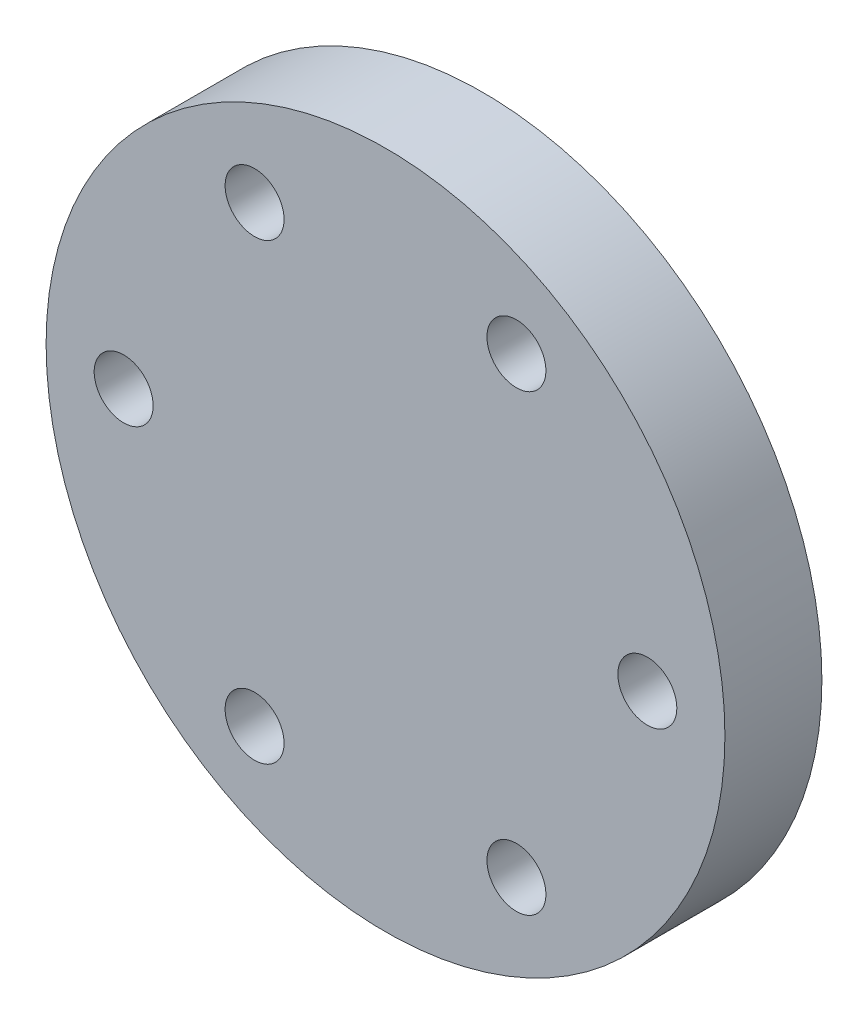
ISO-10303-21;
HEADER;
FILE_DESCRIPTION(('STEP AP214'),'2;1');
FILE_NAME('part.step','',(''),(''),'','','');
FILE_SCHEMA(('AUTOMOTIVE_DESIGN { 1 0 10303 214 1 1 1 1 }'));
ENDSEC;
DATA;
#1=APPLICATION_CONTEXT('core data for automotive mechanical design processes');
#2=APPLICATION_PROTOCOL_DEFINITION('international standard','automotive_design',2000,#1);
#3=PRODUCT_CONTEXT('',#1,'mechanical');
#4=PRODUCT('Part','Part','',(#3));
#5=PRODUCT_RELATED_PRODUCT_CATEGORY('part','',(#4));
#6=PRODUCT_DEFINITION_FORMATION('','',#4);
#7=PRODUCT_DEFINITION_CONTEXT('part definition',#1,'design');
#8=PRODUCT_DEFINITION('design','',#6,#7);
#9=PRODUCT_DEFINITION_SHAPE('','',#8);
#10=(LENGTH_UNIT() NAMED_UNIT(*) SI_UNIT(.MILLI.,.METRE.));
#11=(NAMED_UNIT(*) PLANE_ANGLE_UNIT() SI_UNIT($,.RADIAN.));
#12=(NAMED_UNIT(*) SI_UNIT($,.STERADIAN.) SOLID_ANGLE_UNIT());
#13=UNCERTAINTY_MEASURE_WITH_UNIT(LENGTH_MEASURE(1.E-05),#10,'distance_accuracy_value','');
#14=(GEOMETRIC_REPRESENTATION_CONTEXT(3) GLOBAL_UNCERTAINTY_ASSIGNED_CONTEXT((#13)) GLOBAL_UNIT_ASSIGNED_CONTEXT((#10,
#11,#12)) REPRESENTATION_CONTEXT('',''));
#15=CARTESIAN_POINT('',(0.,0.,0.));
#16=DIRECTION('',(0.,0.,1.));
#17=DIRECTION('',(1.,0.,0.));
#18=AXIS2_PLACEMENT_3D('',#15,#16,#17);
#19=CARTESIAN_POINT('',(0.,0.,0.));
#20=DIRECTION('',(0.,0.,1.));
#21=DIRECTION('',(1.,0.,0.));
#22=AXIS2_PLACEMENT_3D('',#19,#20,#21);
#23=PLANE('',#22);
#24=CARTESIAN_POINT('',(-6.75000000000001,-11.6913429510899,0.));
#25=DIRECTION('',(0.,0.,1.));
#26=DIRECTION('',(1.,0.,0.));
#27=AXIS2_PLACEMENT_3D('',#24,#25,#26);
#28=CIRCLE('',#27,1.52);
#29=CARTESIAN_POINT('',(-5.23000000000001,-11.6913429510899,0.));
#30=VERTEX_POINT('',#29);
#31=EDGE_CURVE('E75',#30,#30,#28,.T.);
#32=ORIENTED_EDGE('',*,*,#31,.F.);
#33=EDGE_LOOP('',(#32));
#34=FACE_BOUND('',#33,.T.);
#35=CARTESIAN_POINT('',(-6.75,11.6913429510899,0.));
#36=DIRECTION('',(0.,0.,1.));
#37=DIRECTION('',(1.,0.,0.));
#38=AXIS2_PLACEMENT_3D('',#35,#36,#37);
#39=CIRCLE('',#38,1.52);
#40=CARTESIAN_POINT('',(-5.23,11.6913429510899,0.));
#41=VERTEX_POINT('',#40);
#42=EDGE_CURVE('E63',#41,#41,#39,.T.);
#43=ORIENTED_EDGE('',*,*,#42,.F.);
#44=EDGE_LOOP('',(#43));
#45=FACE_BOUND('',#44,.T.);
#46=CARTESIAN_POINT('',(13.5,0.,0.));
#47=DIRECTION('',(0.,0.,1.));
#48=DIRECTION('',(1.,0.,0.));
#49=AXIS2_PLACEMENT_3D('',#46,#47,#48);
#50=CIRCLE('',#49,1.52);
#51=CARTESIAN_POINT('',(15.02,0.,0.));
#52=VERTEX_POINT('',#51);
#53=EDGE_CURVE('E52',#52,#52,#50,.T.);
#54=ORIENTED_EDGE('',*,*,#53,.F.);
#55=EDGE_LOOP('',(#54));
#56=FACE_BOUND('',#55,.T.);
#57=CARTESIAN_POINT('',(0.,0.,0.));
#58=DIRECTION('',(0.,0.,1.));
#59=DIRECTION('',(1.,0.,0.));
#60=AXIS2_PLACEMENT_3D('',#57,#58,#59);
#61=CIRCLE('',#60,17.5);
#62=CARTESIAN_POINT('',(17.5,0.,0.));
#63=VERTEX_POINT('',#62);
#64=EDGE_CURVE('E10',#63,#63,#61,.T.);
#65=ORIENTED_EDGE('',*,*,#64,.T.);
#66=EDGE_LOOP('',(#65));
#67=FACE_BOUND('',#66,.T.);
#68=CARTESIAN_POINT('',(6.75,11.6913429510899,0.));
#69=DIRECTION('',(0.,0.,1.));
#70=DIRECTION('',(1.,0.,0.));
#71=AXIS2_PLACEMENT_3D('',#68,#69,#70);
#72=CIRCLE('',#71,1.52);
#73=CARTESIAN_POINT('',(8.27,11.6913429510899,0.));
#74=VERTEX_POINT('',#73);
#75=EDGE_CURVE('E57',#74,#74,#72,.T.);
#76=ORIENTED_EDGE('',*,*,#75,.F.);
#77=EDGE_LOOP('',(#76));
#78=FACE_BOUND('',#77,.T.);
#79=CARTESIAN_POINT('',(-13.5,0.,0.));
#80=DIRECTION('',(0.,0.,1.));
#81=DIRECTION('',(1.,0.,0.));
#82=AXIS2_PLACEMENT_3D('',#79,#80,#81);
#83=CIRCLE('',#82,1.52);
#84=CARTESIAN_POINT('',(-11.98,0.,0.));
#85=VERTEX_POINT('',#84);
#86=EDGE_CURVE('E69',#85,#85,#83,.T.);
#87=ORIENTED_EDGE('',*,*,#86,.F.);
#88=EDGE_LOOP('',(#87));
#89=FACE_BOUND('',#88,.T.);
#90=CARTESIAN_POINT('',(6.75,-11.6913429510899,0.));
#91=DIRECTION('',(0.,0.,1.));
#92=DIRECTION('',(1.,0.,0.));
#93=AXIS2_PLACEMENT_3D('',#90,#91,#92);
#94=CIRCLE('',#93,1.52);
#95=CARTESIAN_POINT('',(8.27,-11.6913429510899,0.));
#96=VERTEX_POINT('',#95);
#97=EDGE_CURVE('E81',#96,#96,#94,.T.);
#98=ORIENTED_EDGE('',*,*,#97,.F.);
#99=EDGE_LOOP('',(#98));
#100=FACE_BOUND('',#99,.T.);
#101=ADVANCED_FACE('F41',(#34,#45,#56,#67,#78,#89,#100),#23,.T.);
#102=CARTESIAN_POINT('',(0.,0.,-5.));
#103=DIRECTION('',(0.,0.,1.));
#104=DIRECTION('',(1.,0.,0.));
#105=AXIS2_PLACEMENT_3D('',#102,#103,#104);
#106=PLANE('',#105);
#107=CARTESIAN_POINT('',(0.,0.,-5.));
#108=DIRECTION('',(0.,0.,1.));
#109=DIRECTION('',(1.,0.,0.));
#110=AXIS2_PLACEMENT_3D('',#107,#108,#109);
#111=CIRCLE('',#110,17.5);
#112=CARTESIAN_POINT('',(17.5,0.,-5.));
#113=VERTEX_POINT('',#112);
#114=EDGE_CURVE('E45',#113,#113,#111,.T.);
#115=ORIENTED_EDGE('',*,*,#114,.F.);
#116=EDGE_LOOP('',(#115));
#117=FACE_BOUND('',#116,.T.);
#118=CARTESIAN_POINT('',(13.5,0.,-5.));
#119=DIRECTION('',(0.,0.,1.));
#120=DIRECTION('',(1.,0.,0.));
#121=AXIS2_PLACEMENT_3D('',#118,#119,#120);
#122=CIRCLE('',#121,1.52);
#123=CARTESIAN_POINT('',(15.02,0.,-5.));
#124=VERTEX_POINT('',#123);
#125=EDGE_CURVE('E54',#124,#124,#122,.T.);
#126=ORIENTED_EDGE('',*,*,#125,.T.);
#127=EDGE_LOOP('',(#126));
#128=FACE_BOUND('',#127,.T.);
#129=CARTESIAN_POINT('',(6.75,11.6913429510899,-5.));
#130=DIRECTION('',(0.,0.,1.));
#131=DIRECTION('',(1.,0.,0.));
#132=AXIS2_PLACEMENT_3D('',#129,#130,#131);
#133=CIRCLE('',#132,1.52);
#134=CARTESIAN_POINT('',(8.27,11.6913429510899,-5.));
#135=VERTEX_POINT('',#134);
#136=EDGE_CURVE('E60',#135,#135,#133,.T.);
#137=ORIENTED_EDGE('',*,*,#136,.T.);
#138=EDGE_LOOP('',(#137));
#139=FACE_BOUND('',#138,.T.);
#140=CARTESIAN_POINT('',(-6.75,11.6913429510899,-5.));
#141=DIRECTION('',(0.,0.,1.));
#142=DIRECTION('',(1.,0.,0.));
#143=AXIS2_PLACEMENT_3D('',#140,#141,#142);
#144=CIRCLE('',#143,1.52);
#145=CARTESIAN_POINT('',(-5.23,11.6913429510899,-5.));
#146=VERTEX_POINT('',#145);
#147=EDGE_CURVE('E66',#146,#146,#144,.T.);
#148=ORIENTED_EDGE('',*,*,#147,.T.);
#149=EDGE_LOOP('',(#148));
#150=FACE_BOUND('',#149,.T.);
#151=CARTESIAN_POINT('',(-13.5,0.,-5.));
#152=DIRECTION('',(0.,0.,1.));
#153=DIRECTION('',(1.,0.,0.));
#154=AXIS2_PLACEMENT_3D('',#151,#152,#153);
#155=CIRCLE('',#154,1.52);
#156=CARTESIAN_POINT('',(-11.98,0.,-5.));
#157=VERTEX_POINT('',#156);
#158=EDGE_CURVE('E72',#157,#157,#155,.T.);
#159=ORIENTED_EDGE('',*,*,#158,.T.);
#160=EDGE_LOOP('',(#159));
#161=FACE_BOUND('',#160,.T.);
#162=CARTESIAN_POINT('',(-6.75000000000001,-11.6913429510899,-5.));
#163=DIRECTION('',(0.,0.,1.));
#164=DIRECTION('',(1.,0.,0.));
#165=AXIS2_PLACEMENT_3D('',#162,#163,#164);
#166=CIRCLE('',#165,1.52);
#167=CARTESIAN_POINT('',(-5.23000000000001,-11.6913429510899,-5.));
#168=VERTEX_POINT('',#167);
#169=EDGE_CURVE('E78',#168,#168,#166,.T.);
#170=ORIENTED_EDGE('',*,*,#169,.T.);
#171=EDGE_LOOP('',(#170));
#172=FACE_BOUND('',#171,.T.);
#173=CARTESIAN_POINT('',(6.75,-11.6913429510899,-5.));
#174=DIRECTION('',(0.,0.,1.));
#175=DIRECTION('',(1.,0.,0.));
#176=AXIS2_PLACEMENT_3D('',#173,#174,#175);
#177=CIRCLE('',#176,1.52);
#178=CARTESIAN_POINT('',(8.27,-11.6913429510899,-5.));
#179=VERTEX_POINT('',#178);
#180=EDGE_CURVE('E84',#179,#179,#177,.T.);
#181=ORIENTED_EDGE('',*,*,#180,.T.);
#182=EDGE_LOOP('',(#181));
#183=FACE_BOUND('',#182,.T.);
#184=ADVANCED_FACE('F94',(#117,#128,#139,#150,#161,#172,#183),#106,.F.);
#185=CARTESIAN_POINT('',(0.,0.,0.));
#186=DIRECTION('',(0.,0.,-1.));
#187=DIRECTION('',(-1.,0.,0.));
#188=AXIS2_PLACEMENT_3D('',#185,#186,#187);
#189=CYLINDRICAL_SURFACE('',#188,17.5);
#190=ORIENTED_EDGE('',*,*,#64,.F.);
#191=EDGE_LOOP('',(#190));
#192=FACE_BOUND('',#191,.T.);
#193=ORIENTED_EDGE('',*,*,#114,.T.);
#194=EDGE_LOOP('',(#193));
#195=FACE_BOUND('',#194,.T.);
#196=ADVANCED_FACE('F43',(#192,#195),#189,.T.);
#197=CARTESIAN_POINT('',(13.5,0.,0.));
#198=DIRECTION('',(0.,0.,-1.));
#199=DIRECTION('',(-1.,0.,0.));
#200=AXIS2_PLACEMENT_3D('',#197,#198,#199);
#201=CYLINDRICAL_SURFACE('',#200,1.52);
#202=ORIENTED_EDGE('',*,*,#53,.T.);
#203=EDGE_LOOP('',(#202));
#204=FACE_BOUND('',#203,.T.);
#205=ORIENTED_EDGE('',*,*,#125,.F.);
#206=EDGE_LOOP('',(#205));
#207=FACE_BOUND('',#206,.T.);
#208=ADVANCED_FACE('F104',(#204,#207),#201,.F.);
#209=CARTESIAN_POINT('',(6.75,11.6913429510899,0.));
#210=DIRECTION('',(0.,0.,-1.));
#211=DIRECTION('',(-1.,0.,0.));
#212=AXIS2_PLACEMENT_3D('',#209,#210,#211);
#213=CYLINDRICAL_SURFACE('',#212,1.52);
#214=ORIENTED_EDGE('',*,*,#75,.T.);
#215=EDGE_LOOP('',(#214));
#216=FACE_BOUND('',#215,.T.);
#217=ORIENTED_EDGE('',*,*,#136,.F.);
#218=EDGE_LOOP('',(#217));
#219=FACE_BOUND('',#218,.T.);
#220=ADVANCED_FACE('F107',(#216,#219),#213,.F.);
#221=CARTESIAN_POINT('',(-6.75,11.6913429510899,0.));
#222=DIRECTION('',(0.,0.,-1.));
#223=DIRECTION('',(-1.,0.,0.));
#224=AXIS2_PLACEMENT_3D('',#221,#222,#223);
#225=CYLINDRICAL_SURFACE('',#224,1.52);
#226=ORIENTED_EDGE('',*,*,#42,.T.);
#227=EDGE_LOOP('',(#226));
#228=FACE_BOUND('',#227,.T.);
#229=ORIENTED_EDGE('',*,*,#147,.F.);
#230=EDGE_LOOP('',(#229));
#231=FACE_BOUND('',#230,.T.);
#232=ADVANCED_FACE('F111',(#228,#231),#225,.F.);
#233=CARTESIAN_POINT('',(-13.5,0.,0.));
#234=DIRECTION('',(0.,0.,-1.));
#235=DIRECTION('',(-1.,0.,0.));
#236=AXIS2_PLACEMENT_3D('',#233,#234,#235);
#237=CYLINDRICAL_SURFACE('',#236,1.52);
#238=ORIENTED_EDGE('',*,*,#86,.T.);
#239=EDGE_LOOP('',(#238));
#240=FACE_BOUND('',#239,.T.);
#241=ORIENTED_EDGE('',*,*,#158,.F.);
#242=EDGE_LOOP('',(#241));
#243=FACE_BOUND('',#242,.T.);
#244=ADVANCED_FACE('F115',(#240,#243),#237,.F.);
#245=CARTESIAN_POINT('',(-6.75000000000001,-11.6913429510899,0.));
#246=DIRECTION('',(0.,0.,-1.));
#247=DIRECTION('',(-1.,0.,0.));
#248=AXIS2_PLACEMENT_3D('',#245,#246,#247);
#249=CYLINDRICAL_SURFACE('',#248,1.52);
#250=ORIENTED_EDGE('',*,*,#31,.T.);
#251=EDGE_LOOP('',(#250));
#252=FACE_BOUND('',#251,.T.);
#253=ORIENTED_EDGE('',*,*,#169,.F.);
#254=EDGE_LOOP('',(#253));
#255=FACE_BOUND('',#254,.T.);
#256=ADVANCED_FACE('F119',(#252,#255),#249,.F.);
#257=CARTESIAN_POINT('',(6.75,-11.6913429510899,0.));
#258=DIRECTION('',(0.,0.,-1.));
#259=DIRECTION('',(-1.,0.,0.));
#260=AXIS2_PLACEMENT_3D('',#257,#258,#259);
#261=CYLINDRICAL_SURFACE('',#260,1.52);
#262=ORIENTED_EDGE('',*,*,#97,.T.);
#263=EDGE_LOOP('',(#262));
#264=FACE_BOUND('',#263,.T.);
#265=ORIENTED_EDGE('',*,*,#180,.F.);
#266=EDGE_LOOP('',(#265));
#267=FACE_BOUND('',#266,.T.);
#268=ADVANCED_FACE('F90',(#264,#267),#261,.F.);
#269=CLOSED_SHELL('',(#101,#184,#196,#208,#220,#232,#244,#256,#268));
#270=MANIFOLD_SOLID_BREP('B2',#269);
#271=ADVANCED_BREP_SHAPE_REPRESENTATION('',(#18,#270),#14);
#272=SHAPE_DEFINITION_REPRESENTATION(#9,#271);
ENDSEC;
END-ISO-10303-21;
